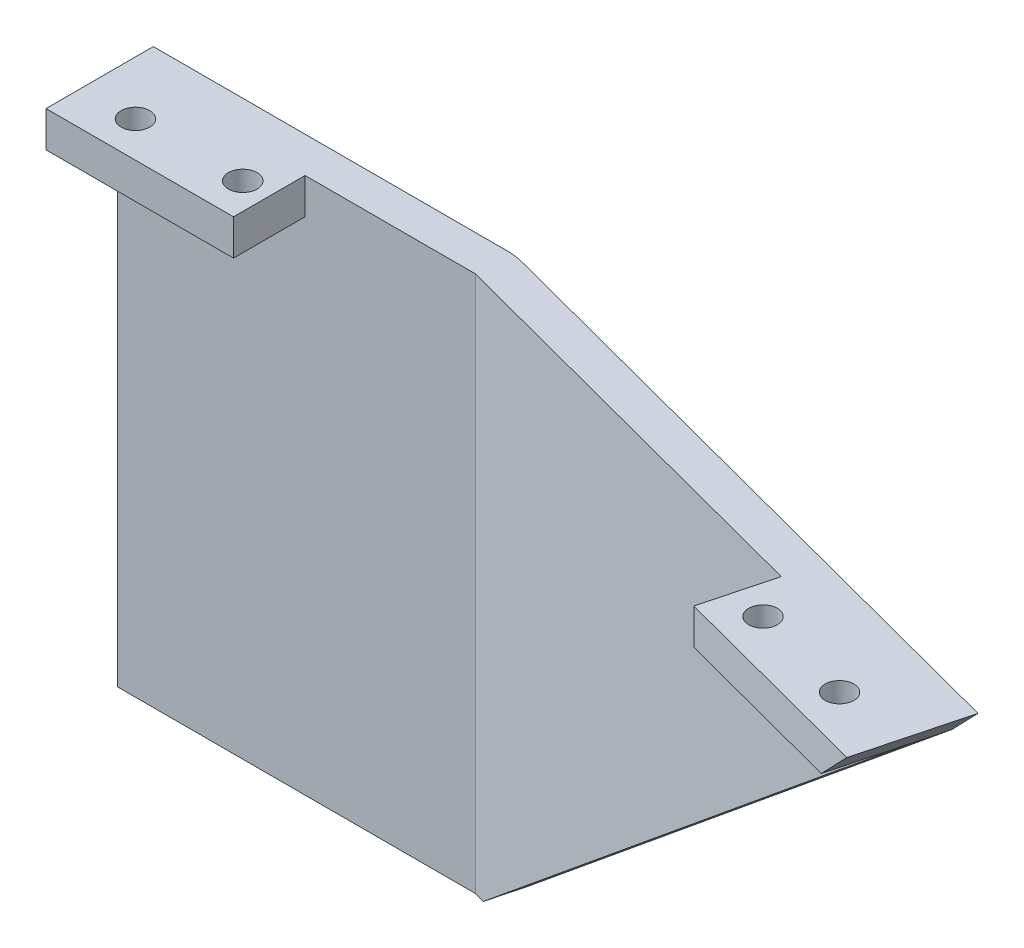
ISO-10303-21;
HEADER;
FILE_DESCRIPTION(('STEP AP214'),'2;1');
FILE_NAME('part.step','',(''),(''),'','','');
FILE_SCHEMA(('AUTOMOTIVE_DESIGN { 1 0 10303 214 1 1 1 1 }'));
ENDSEC;
DATA;
#1=APPLICATION_CONTEXT('core data for automotive mechanical design processes');
#2=APPLICATION_PROTOCOL_DEFINITION('international standard','automotive_design',2000,#1);
#3=PRODUCT_CONTEXT('',#1,'mechanical');
#4=PRODUCT('Part','Part','',(#3));
#5=PRODUCT_RELATED_PRODUCT_CATEGORY('part','',(#4));
#6=PRODUCT_DEFINITION_FORMATION('','',#4);
#7=PRODUCT_DEFINITION_CONTEXT('part definition',#1,'design');
#8=PRODUCT_DEFINITION('design','',#6,#7);
#9=PRODUCT_DEFINITION_SHAPE('','',#8);
#10=(LENGTH_UNIT() NAMED_UNIT(*) SI_UNIT(.MILLI.,.METRE.));
#11=(NAMED_UNIT(*) PLANE_ANGLE_UNIT() SI_UNIT($,.RADIAN.));
#12=(NAMED_UNIT(*) SI_UNIT($,.STERADIAN.) SOLID_ANGLE_UNIT());
#13=UNCERTAINTY_MEASURE_WITH_UNIT(LENGTH_MEASURE(1.E-05),#10,'distance_accuracy_value','');
#14=(GEOMETRIC_REPRESENTATION_CONTEXT(3) GLOBAL_UNCERTAINTY_ASSIGNED_CONTEXT((#13)) GLOBAL_UNIT_ASSIGNED_CONTEXT((#10,
#11,#12)) REPRESENTATION_CONTEXT('',''));
#15=CARTESIAN_POINT('',(0.,0.,0.));
#16=DIRECTION('',(0.,0.,1.));
#17=DIRECTION('',(1.,0.,0.));
#18=AXIS2_PLACEMENT_3D('',#15,#16,#17);
#19=CARTESIAN_POINT('',(0.,65.,0.));
#20=DIRECTION('',(0.,1.,0.));
#21=DIRECTION('',(0.,0.,1.));
#22=AXIS2_PLACEMENT_3D('',#19,#20,#21);
#23=PLANE('',#22);
#24=CARTESIAN_POINT('',(-30.,65.,20.));
#25=DIRECTION('',(0.,-1.,0.));
#26=DIRECTION('',(0.,0.,-1.));
#27=AXIS2_PLACEMENT_3D('',#24,#25,#26);
#28=CIRCLE('',#27,4.);
#29=CARTESIAN_POINT('',(-30.,65.,16.));
#30=VERTEX_POINT('',#29);
#31=EDGE_CURVE('E319',#30,#30,#28,.T.);
#32=ORIENTED_EDGE('',*,*,#31,.F.);
#33=EDGE_LOOP('',(#32));
#34=FACE_BOUND('',#33,.T.);
#35=CARTESIAN_POINT('',(-60.,65.,20.));
#36=DIRECTION('',(0.,-1.,0.));
#37=DIRECTION('',(0.,0.,-1.));
#38=AXIS2_PLACEMENT_3D('',#35,#36,#37);
#39=CIRCLE('',#38,4.00000000000001);
#40=CARTESIAN_POINT('',(-60.,65.,16.));
#41=VERTEX_POINT('',#40);
#42=EDGE_CURVE('E321',#41,#41,#39,.T.);
#43=ORIENTED_EDGE('',*,*,#42,.F.);
#44=EDGE_LOOP('',(#43));
#45=FACE_BOUND('',#44,.T.);
#46=DIRECTION('',(-1.,0.,0.));
#47=VECTOR('',#46,1.);
#48=CARTESIAN_POINT('',(-25.,65.,10.));
#49=LINE('',#48,#47);
#50=CARTESIAN_POINT('',(-22.5875308175575,65.,10.));
#51=VERTEX_POINT('',#50);
#52=CARTESIAN_POINT('',(-75.,65.,10.));
#53=VERTEX_POINT('',#52);
#54=EDGE_CURVE('E165',#51,#53,#49,.T.);
#55=ORIENTED_EDGE('',*,*,#54,.F.);
#56=DIRECTION('',(0.,0.,1.));
#57=VECTOR('',#56,1.);
#58=CARTESIAN_POINT('',(-22.5875308175575,65.,30.));
#59=LINE('',#58,#57);
#60=CARTESIAN_POINT('',(-22.5875308175575,65.,30.));
#61=VERTEX_POINT('',#60);
#62=EDGE_CURVE('E154',#51,#61,#59,.T.);
#63=ORIENTED_EDGE('',*,*,#62,.T.);
#64=DIRECTION('',(1.,0.,0.));
#65=VECTOR('',#64,1.);
#66=CARTESIAN_POINT('',(-25.,65.,30.));
#67=LINE('',#66,#65);
#68=CARTESIAN_POINT('',(-75.,65.,30.));
#69=VERTEX_POINT('',#68);
#70=EDGE_CURVE('E163',#69,#61,#67,.T.);
#71=ORIENTED_EDGE('',*,*,#70,.F.);
#72=DIRECTION('',(0.,0.,1.));
#73=VECTOR('',#72,1.);
#74=CARTESIAN_POINT('',(-75.,65.,10.));
#75=LINE('',#74,#73);
#76=EDGE_CURVE('E352',#53,#69,#75,.T.);
#77=ORIENTED_EDGE('',*,*,#76,.F.);
#78=EDGE_LOOP('',(#55,#63,#71,#77));
#79=FACE_BOUND('',#78,.T.);
#80=ADVANCED_FACE('F46',(#34,#45,#79),#23,.F.);
#81=CARTESIAN_POINT('',(0.,0.,10.));
#82=DIRECTION('',(0.,0.,1.));
#83=DIRECTION('',(1.,0.,0.));
#84=AXIS2_PLACEMENT_3D('',#81,#82,#83);
#85=PLANE('',#84);
#86=DIRECTION('',(0.,1.,0.));
#87=VECTOR('',#86,1.);
#88=CARTESIAN_POINT('',(25.,75.,10.));
#89=LINE('',#88,#87);
#90=CARTESIAN_POINT('',(25.,-75.,10.));
#91=VERTEX_POINT('',#90);
#92=CARTESIAN_POINT('',(24.9999999999966,75.,10.));
#93=VERTEX_POINT('',#92);
#94=EDGE_CURVE('E415',#91,#93,#89,.T.);
#95=ORIENTED_EDGE('',*,*,#94,.T.);
#96=DIRECTION('',(-1.,0.,0.));
#97=VECTOR('',#96,1.);
#98=CARTESIAN_POINT('',(-22.5875308175575,75.,10.));
#99=LINE('',#98,#97);
#100=CARTESIAN_POINT('',(-22.5875308175575,75.,10.));
#101=VERTEX_POINT('',#100);
#102=EDGE_CURVE('E384',#93,#101,#99,.T.);
#103=ORIENTED_EDGE('',*,*,#102,.T.);
#104=DIRECTION('',(0.,1.,0.));
#105=VECTOR('',#104,1.);
#106=CARTESIAN_POINT('',(-22.5875308175575,65.,10.));
#107=LINE('',#106,#105);
#108=EDGE_CURVE('E393',#51,#101,#107,.T.);
#109=ORIENTED_EDGE('',*,*,#108,.F.);
#110=ORIENTED_EDGE('',*,*,#54,.T.);
#111=DIRECTION('',(0.,1.,0.));
#112=VECTOR('',#111,1.);
#113=CARTESIAN_POINT('',(-75.,-75.,10.));
#114=LINE('',#113,#112);
#115=CARTESIAN_POINT('',(-75.,-75.,10.));
#116=VERTEX_POINT('',#115);
#117=EDGE_CURVE('E349',#116,#53,#114,.T.);
#118=ORIENTED_EDGE('',*,*,#117,.F.);
#119=DIRECTION('',(1.,0.,0.));
#120=VECTOR('',#119,1.);
#121=CARTESIAN_POINT('',(-25.,-75.,10.));
#122=LINE('',#121,#120);
#123=EDGE_CURVE('E57',#116,#91,#122,.T.);
#124=ORIENTED_EDGE('',*,*,#123,.T.);
#125=EDGE_LOOP('',(#95,#103,#109,#110,#118,#124));
#126=FACE_BOUND('',#125,.T.);
#127=ADVANCED_FACE('F218',(#126),#85,.T.);
#128=CARTESIAN_POINT('',(295.780870433541,75.,81.2581237983003));
#129=DIRECTION('',(0.254493299279644,0.,-0.967074537262646));
#130=DIRECTION('',(-0.967074537262646,0.,-0.254493299279644));
#131=AXIS2_PLACEMENT_3D('',#128,#129,#130);
#132=PLANE('',#131);
#133=DIRECTION('',(-0.967074537262646,0.,-0.254493299279644));
#134=VECTOR('',#133,1.);
#135=CARTESIAN_POINT('',(295.780870433541,-75.,81.2581237983003));
#136=LINE('',#135,#134);
#137=CARTESIAN_POINT('',(28.0506337621708,-75.,10.802798358466));
#138=VERTEX_POINT('',#137);
#139=EDGE_CURVE('E51',#138,#91,#136,.T.);
#140=ORIENTED_EDGE('',*,*,#139,.F.);
#141=DIRECTION('',(0.740822075351906,0.642787609686541,0.194953177724186));
#142=VECTOR('',#141,1.);
#143=CARTESIAN_POINT('',(256.589873602786,123.296185527337,70.9447035796806));
#144=LINE('',#143,#142);
#145=CARTESIAN_POINT('',(189.40267133465,65.,53.2638608775398));
#146=VERTEX_POINT('',#145);
#147=EDGE_CURVE('E367',#138,#146,#144,.T.);
#148=ORIENTED_EDGE('',*,*,#147,.T.);
#149=DIRECTION('',(-0.967074537262647,0.,-0.254493299279641));
#150=VECTOR('',#149,1.);
#151=CARTESIAN_POINT('',(24.9999999999965,65.,10.));
#152=LINE('',#151,#150);
#153=CARTESIAN_POINT('',(141.048944471514,65.,40.5391959135569));
#154=VERTEX_POINT('',#153);
#155=EDGE_CURVE('E162',#146,#154,#152,.T.);
#156=ORIENTED_EDGE('',*,*,#155,.T.);
#157=DIRECTION('',(0.,1.,0.));
#158=VECTOR('',#157,1.);
#159=CARTESIAN_POINT('',(141.048944471514,65.,40.5391959135569));
#160=LINE('',#159,#158);
#161=CARTESIAN_POINT('',(141.048944471514,75.,40.5391959135569));
#162=VERTEX_POINT('',#161);
#163=EDGE_CURVE('E65',#154,#162,#160,.T.);
#164=ORIENTED_EDGE('',*,*,#163,.T.);
#165=DIRECTION('',(-0.967074537262647,0.,-0.254493299279641));
#166=VECTOR('',#165,1.);
#167=CARTESIAN_POINT('',(24.9999999999966,75.,10.));
#168=LINE('',#167,#166);
#169=EDGE_CURVE('E382',#162,#93,#168,.T.);
#170=ORIENTED_EDGE('',*,*,#169,.T.);
#171=ORIENTED_EDGE('',*,*,#94,.F.);
#172=EDGE_LOOP('',(#140,#148,#156,#164,#170,#171));
#173=FACE_BOUND('',#172,.T.);
#174=ADVANCED_FACE('F215',(#173),#132,.F.);
#175=CARTESIAN_POINT('',(-25.,75.,10.));
#176=DIRECTION('',(0.,-1.,0.));
#177=DIRECTION('',(0.,0.,-1.));
#178=AXIS2_PLACEMENT_3D('',#175,#176,#177);
#179=PLANE('',#178);
#180=CARTESIAN_POINT('',(-60.,75.,20.));
#181=DIRECTION('',(0.,-1.,0.));
#182=DIRECTION('',(0.,0.,-1.));
#183=AXIS2_PLACEMENT_3D('',#180,#181,#182);
#184=CIRCLE('',#183,4.00000000000001);
#185=CARTESIAN_POINT('',(-60.,75.,16.));
#186=VERTEX_POINT('',#185);
#187=EDGE_CURVE('E337',#186,#186,#184,.T.);
#188=ORIENTED_EDGE('',*,*,#187,.T.);
#189=EDGE_LOOP('',(#188));
#190=FACE_BOUND('',#189,.T.);
#191=CARTESIAN_POINT('',(177.186992969227,75.,60.3896732573699));
#192=DIRECTION('',(0.,-1.,0.));
#193=DIRECTION('',(0.,0.,-1.));
#194=AXIS2_PLACEMENT_3D('',#191,#192,#193);
#195=CIRCLE('',#194,3.99999999999999);
#196=CARTESIAN_POINT('',(177.186992969227,75.,56.3896732573699));
#197=VERTEX_POINT('',#196);
#198=EDGE_CURVE('E334',#197,#197,#195,.T.);
#199=ORIENTED_EDGE('',*,*,#198,.T.);
#200=EDGE_LOOP('',(#199));
#201=FACE_BOUND('',#200,.T.);
#202=CARTESIAN_POINT('',(148.174756851348,75.,52.7548742789806));
#203=DIRECTION('',(0.,-1.,0.));
#204=DIRECTION('',(0.,0.,-1.));
#205=AXIS2_PLACEMENT_3D('',#202,#203,#204);
#206=CIRCLE('',#205,4.00000000000005);
#207=CARTESIAN_POINT('',(148.174756851348,75.,48.7548742789806));
#208=VERTEX_POINT('',#207);
#209=EDGE_CURVE('E331',#208,#208,#206,.T.);
#210=ORIENTED_EDGE('',*,*,#209,.T.);
#211=EDGE_LOOP('',(#210));
#212=FACE_BOUND('',#211,.T.);
#213=CARTESIAN_POINT('',(-30.,75.,20.));
#214=DIRECTION('',(0.,-1.,0.));
#215=DIRECTION('',(0.,0.,-1.));
#216=AXIS2_PLACEMENT_3D('',#213,#214,#215);
#217=CIRCLE('',#216,4.);
#218=CARTESIAN_POINT('',(-30.,75.,16.));
#219=VERTEX_POINT('',#218);
#220=EDGE_CURVE('E328',#219,#219,#217,.T.);
#221=ORIENTED_EDGE('',*,*,#220,.T.);
#222=EDGE_LOOP('',(#221));
#223=FACE_BOUND('',#222,.T.);
#224=DIRECTION('',(1.,0.,0.));
#225=VECTOR('',#224,1.);
#226=CARTESIAN_POINT('',(-25.,75.,30.));
#227=LINE('',#226,#225);
#228=CARTESIAN_POINT('',(-75.,75.,30.));
#229=VERTEX_POINT('',#228);
#230=CARTESIAN_POINT('',(-22.5875308175575,75.,30.));
#231=VERTEX_POINT('',#230);
#232=EDGE_CURVE('E173',#229,#231,#227,.T.);
#233=ORIENTED_EDGE('',*,*,#232,.T.);
#234=DIRECTION('',(0.,0.,1.));
#235=VECTOR('',#234,1.);
#236=CARTESIAN_POINT('',(-22.5875308175575,75.,30.));
#237=LINE('',#236,#235);
#238=EDGE_CURVE('E155',#101,#231,#237,.T.);
#239=ORIENTED_EDGE('',*,*,#238,.F.);
#240=ORIENTED_EDGE('',*,*,#102,.F.);
#241=ORIENTED_EDGE('',*,*,#169,.F.);
#242=DIRECTION('',(0.25449329927964,0.,-0.967074537262647));
#243=VECTOR('',#242,1.);
#244=CARTESIAN_POINT('',(141.048944471514,75.,40.5391959135569));
#245=LINE('',#244,#243);
#246=CARTESIAN_POINT('',(135.959078485921,75.,59.8806866588099));
#247=VERTEX_POINT('',#246);
#248=EDGE_CURVE('E379',#247,#162,#245,.T.);
#249=ORIENTED_EDGE('',*,*,#248,.F.);
#250=DIRECTION('',(0.967074537262647,0.,0.254493299279641));
#251=VECTOR('',#250,1.);
#252=CARTESIAN_POINT('',(22.4124691824425,75.,30.));
#253=LINE('',#252,#251);
#254=CARTESIAN_POINT('',(194.018596062696,75.,75.1595070737504));
#255=VERTEX_POINT('',#254);
#256=EDGE_CURVE('E159',#247,#255,#253,.T.);
#257=ORIENTED_EDGE('',*,*,#256,.T.);
#258=DIRECTION('',(0.254493299279644,0.,-0.967074537262646));
#259=VECTOR('',#258,1.);
#260=CARTESIAN_POINT('',(195.870120079377,75.,68.1237158103624));
#261=LINE('',#260,#259);
#262=CARTESIAN_POINT('',(201.653395041085,75.,46.1472709558707));
#263=VERTEX_POINT('',#262);
#264=EDGE_CURVE('E372',#255,#263,#261,.T.);
#265=ORIENTED_EDGE('',*,*,#264,.T.);
#266=DIRECTION('',(-0.967074537262646,0.,-0.254493299279644));
#267=VECTOR('',#266,1.);
#268=CARTESIAN_POINT('',(298.325803426337,75.,71.5873784256738));
#269=LINE('',#268,#267);
#270=CARTESIAN_POINT('',(27.5449329927964,75.,0.329254627373538));
#271=VERTEX_POINT('',#270);
#272=EDGE_CURVE('E172',#263,#271,#269,.T.);
#273=ORIENTED_EDGE('',*,*,#272,.T.);
#274=DIRECTION('',(0.991734474862764,0.,0.128307175826908));
#275=VECTOR('',#274,1.);
#276=CARTESIAN_POINT('',(25.,75.,0.));
#277=LINE('',#276,#275);
#278=CARTESIAN_POINT('',(25.,75.,0.));
#279=VERTEX_POINT('',#278);
#280=EDGE_CURVE('E183',#279,#271,#277,.T.);
#281=ORIENTED_EDGE('',*,*,#280,.F.);
#282=DIRECTION('',(-1.,0.,0.));
#283=VECTOR('',#282,1.);
#284=CARTESIAN_POINT('',(-25.,75.,0.));
#285=LINE('',#284,#283);
#286=CARTESIAN_POINT('',(-75.,75.,0.));
#287=VERTEX_POINT('',#286);
#288=EDGE_CURVE('E265',#279,#287,#285,.T.);
#289=ORIENTED_EDGE('',*,*,#288,.T.);
#290=DIRECTION('',(0.,0.,-1.));
#291=VECTOR('',#290,1.);
#292=CARTESIAN_POINT('',(-75.,75.,30.));
#293=LINE('',#292,#291);
#294=EDGE_CURVE('E340',#229,#287,#293,.T.);
#295=ORIENTED_EDGE('',*,*,#294,.F.);
#296=EDGE_LOOP('',(#233,#239,#240,#241,#249,#257,#265,#273,#281,#289,#295));
#297=FACE_BOUND('',#296,.T.);
#298=ADVANCED_FACE('F48',(#190,#201,#212,#223,#297),#179,.F.);
#299=CARTESIAN_POINT('',(-25.,-75.,10.));
#300=DIRECTION('',(0.,1.,0.));
#301=DIRECTION('',(0.,0.,1.));
#302=AXIS2_PLACEMENT_3D('',#299,#300,#301);
#303=PLANE('',#302);
#304=DIRECTION('',(-0.967074537262646,0.,-0.254493299279644));
#305=VECTOR('',#304,1.);
#306=CARTESIAN_POINT('',(298.325803426337,-75.,71.5873784256738));
#307=LINE('',#306,#305);
#308=CARTESIAN_POINT('',(30.5955667549672,-75.,1.13205298583954));
#309=VERTEX_POINT('',#308);
#310=CARTESIAN_POINT('',(27.5449329927964,-75.,0.329254627373538));
#311=VERTEX_POINT('',#310);
#312=EDGE_CURVE('E191',#309,#311,#307,.T.);
#313=ORIENTED_EDGE('',*,*,#312,.F.);
#314=DIRECTION('',(-0.254493299279644,0.,0.967074537262646));
#315=VECTOR('',#314,1.);
#316=CARTESIAN_POINT('',(24.8122917932589,-75.,23.1084978403313));
#317=LINE('',#316,#315);
#318=EDGE_CURVE('E364',#309,#138,#317,.T.);
#319=ORIENTED_EDGE('',*,*,#318,.T.);
#320=ORIENTED_EDGE('',*,*,#139,.T.);
#321=ORIENTED_EDGE('',*,*,#123,.F.);
#322=DIRECTION('',(0.,0.,1.));
#323=VECTOR('',#322,1.);
#324=CARTESIAN_POINT('',(-75.,-75.,0.));
#325=LINE('',#324,#323);
#326=CARTESIAN_POINT('',(-75.,-75.,0.));
#327=VERTEX_POINT('',#326);
#328=EDGE_CURVE('E346',#327,#116,#325,.T.);
#329=ORIENTED_EDGE('',*,*,#328,.F.);
#330=DIRECTION('',(1.,0.,0.));
#331=VECTOR('',#330,1.);
#332=CARTESIAN_POINT('',(-25.,-75.,0.));
#333=LINE('',#332,#331);
#334=CARTESIAN_POINT('',(25.,-75.,0.));
#335=VERTEX_POINT('',#334);
#336=EDGE_CURVE('E412',#327,#335,#333,.T.);
#337=ORIENTED_EDGE('',*,*,#336,.T.);
#338=DIRECTION('',(0.991734474862763,0.,0.128307175826916));
#339=VECTOR('',#338,1.);
#340=CARTESIAN_POINT('',(26.2724664963982,-75.,0.164627313686781));
#341=LINE('',#340,#339);
#342=EDGE_CURVE('E187',#335,#311,#341,.T.);
#343=ORIENTED_EDGE('',*,*,#342,.T.);
#344=EDGE_LOOP('',(#313,#319,#320,#321,#329,#337,#343));
#345=FACE_BOUND('',#344,.T.);
#346=ADVANCED_FACE('F279',(#345),#303,.F.);
#347=CARTESIAN_POINT('',(0.,0.,0.));
#348=DIRECTION('',(0.,0.,1.));
#349=DIRECTION('',(1.,0.,0.));
#350=AXIS2_PLACEMENT_3D('',#347,#348,#349);
#351=PLANE('',#350);
#352=DIRECTION('',(0.,1.,0.));
#353=VECTOR('',#352,1.);
#354=CARTESIAN_POINT('',(25.,0.,0.));
#355=LINE('',#354,#353);
#356=EDGE_CURVE('E255',#335,#279,#355,.T.);
#357=ORIENTED_EDGE('',*,*,#356,.F.);
#358=ORIENTED_EDGE('',*,*,#336,.F.);
#359=DIRECTION('',(0.,-1.,0.));
#360=VECTOR('',#359,1.);
#361=CARTESIAN_POINT('',(-75.,75.,0.));
#362=LINE('',#361,#360);
#363=EDGE_CURVE('E343',#287,#327,#362,.T.);
#364=ORIENTED_EDGE('',*,*,#363,.F.);
#365=ORIENTED_EDGE('',*,*,#288,.F.);
#366=EDGE_LOOP('',(#357,#358,#364,#365));
#367=FACE_BOUND('',#366,.T.);
#368=ADVANCED_FACE('F223',(#367),#351,.F.);
#369=CARTESIAN_POINT('',(0.411568284216929,0.,-3.18116624099558));
#370=DIRECTION('',(0.128307175826908,0.,-0.991734474862764));
#371=DIRECTION('',(-0.991734474862764,0.,-0.128307175826908));
#372=AXIS2_PLACEMENT_3D('',#369,#370,#371);
#373=PLANE('',#372);
#374=ORIENTED_EDGE('',*,*,#280,.T.);
#375=DIRECTION('',(0.,-1.,0.));
#376=VECTOR('',#375,1.);
#377=CARTESIAN_POINT('',(27.5449329927965,75.,0.329254627373545));
#378=LINE('',#377,#376);
#379=EDGE_CURVE('E186',#271,#311,#378,.T.);
#380=ORIENTED_EDGE('',*,*,#379,.T.);
#381=ORIENTED_EDGE('',*,*,#342,.F.);
#382=ORIENTED_EDGE('',*,*,#356,.T.);
#383=EDGE_LOOP('',(#374,#380,#381,#382));
#384=FACE_BOUND('',#383,.T.);
#385=ADVANCED_FACE('F211',(#384),#373,.T.);
#386=CARTESIAN_POINT('',(298.325803426337,-75.,71.5873784256738));
#387=DIRECTION('',(-0.254493299279644,0.,0.967074537262646));
#388=DIRECTION('',(0.967074537262646,0.,0.254493299279644));
#389=AXIS2_PLACEMENT_3D('',#386,#387,#388);
#390=PLANE('',#389);
#391=ORIENTED_EDGE('',*,*,#272,.F.);
#392=DIRECTION('',(-0.685060641650286,-0.705826719184871,-0.18027911622376));
#393=VECTOR('',#392,1.);
#394=CARTESIAN_POINT('',(177.634329287812,50.2528501160437,39.8264641786934));
#395=LINE('',#394,#393);
#396=CARTESIAN_POINT('',(191.947604327446,65.,43.593115504913));
#397=VERTEX_POINT('',#396);
#398=EDGE_CURVE('E176',#263,#397,#395,.T.);
#399=ORIENTED_EDGE('',*,*,#398,.T.);
#400=DIRECTION('',(-0.740822075351906,-0.642787609686541,-0.194953177724186));
#401=VECTOR('',#400,1.);
#402=CARTESIAN_POINT('',(187.706118942811,61.3197988523563,42.4769351405354));
#403=LINE('',#402,#401);
#404=EDGE_CURVE('E361',#397,#309,#403,.T.);
#405=ORIENTED_EDGE('',*,*,#404,.T.);
#406=ORIENTED_EDGE('',*,*,#312,.T.);
#407=ORIENTED_EDGE('',*,*,#379,.F.);
#408=EDGE_LOOP('',(#391,#399,#405,#406,#407));
#409=FACE_BOUND('',#408,.T.);
#410=ADVANCED_FACE('F201',(#409),#390,.F.);
#411=CARTESIAN_POINT('',(22.4124691824425,65.,30.));
#412=DIRECTION('',(-0.254493299279641,0.,0.967074537262647));
#413=DIRECTION('',(0.967074537262647,0.,0.254493299279641));
#414=AXIS2_PLACEMENT_3D('',#411,#412,#413);
#415=PLANE('',#414);
#416=DIRECTION('',(0.,1.,0.));
#417=VECTOR('',#416,1.);
#418=CARTESIAN_POINT('',(135.959078485921,65.,59.8806866588099));
#419=LINE('',#418,#417);
#420=CARTESIAN_POINT('',(135.959078485921,65.,59.8806866588099));
#421=VERTEX_POINT('',#420);
#422=EDGE_CURVE('E149',#421,#247,#419,.T.);
#423=ORIENTED_EDGE('',*,*,#422,.F.);
#424=DIRECTION('',(0.967074537262647,0.,0.254493299279641));
#425=VECTOR('',#424,1.);
#426=CARTESIAN_POINT('',(22.4124691824425,65.,30.));
#427=LINE('',#426,#425);
#428=CARTESIAN_POINT('',(184.312805349057,65.,72.6053516227928));
#429=VERTEX_POINT('',#428);
#430=EDGE_CURVE('E73',#421,#429,#427,.T.);
#431=ORIENTED_EDGE('',*,*,#430,.T.);
#432=DIRECTION('',(-0.685060641650286,-0.705826719184871,-0.180279116223757));
#433=VECTOR('',#432,1.);
#434=CARTESIAN_POINT('',(103.069817439468,-18.7056869518337,51.2256179623749));
#435=LINE('',#434,#433);
#436=EDGE_CURVE('E370',#255,#429,#435,.T.);
#437=ORIENTED_EDGE('',*,*,#436,.F.);
#438=ORIENTED_EDGE('',*,*,#256,.F.);
#439=EDGE_LOOP('',(#423,#431,#437,#438));
#440=FACE_BOUND('',#439,.T.);
#441=ADVANCED_FACE('F158',(#440),#415,.T.);
#442=CARTESIAN_POINT('',(-25.,65.,30.));
#443=DIRECTION('',(0.,0.,1.));
#444=DIRECTION('',(1.,0.,0.));
#445=AXIS2_PLACEMENT_3D('',#442,#443,#444);
#446=PLANE('',#445);
#447=DIRECTION('',(0.,1.,0.));
#448=VECTOR('',#447,1.);
#449=CARTESIAN_POINT('',(-22.5875308175575,65.,30.));
#450=LINE('',#449,#448);
#451=EDGE_CURVE('E324',#61,#231,#450,.T.);
#452=ORIENTED_EDGE('',*,*,#451,.T.);
#453=ORIENTED_EDGE('',*,*,#232,.F.);
#454=DIRECTION('',(0.,1.,0.));
#455=VECTOR('',#454,1.);
#456=CARTESIAN_POINT('',(-75.,65.,30.));
#457=LINE('',#456,#455);
#458=EDGE_CURVE('E355',#69,#229,#457,.T.);
#459=ORIENTED_EDGE('',*,*,#458,.F.);
#460=ORIENTED_EDGE('',*,*,#70,.T.);
#461=EDGE_LOOP('',(#452,#453,#459,#460));
#462=FACE_BOUND('',#461,.T.);
#463=ADVANCED_FACE('F213',(#462),#446,.T.);
#464=CARTESIAN_POINT('',(177.186992969227,65.,60.3896732573699));
#465=DIRECTION('',(0.,-1.,0.));
#466=DIRECTION('',(0.,0.,-1.));
#467=AXIS2_PLACEMENT_3D('',#464,#465,#466);
#468=CIRCLE('',#467,3.99999999999999);
#469=CARTESIAN_POINT('',(177.186992969227,65.,56.3896732573699));
#470=VERTEX_POINT('',#469);
#471=EDGE_CURVE('E314',#470,#470,#468,.T.);
#472=ORIENTED_EDGE('',*,*,#471,.F.);
#473=EDGE_LOOP('',(#472));
#474=FACE_BOUND('',#473,.T.);
#475=CARTESIAN_POINT('',(148.174756851348,65.,52.7548742789806));
#476=DIRECTION('',(0.,-1.,0.));
#477=DIRECTION('',(0.,0.,-1.));
#478=AXIS2_PLACEMENT_3D('',#475,#476,#477);
#479=CIRCLE('',#478,4.00000000000005);
#480=CARTESIAN_POINT('',(148.174756851348,65.,48.7548742789806));
#481=VERTEX_POINT('',#480);
#482=EDGE_CURVE('E317',#481,#481,#479,.T.);
#483=ORIENTED_EDGE('',*,*,#482,.F.);
#484=EDGE_LOOP('',(#483));
#485=FACE_BOUND('',#484,.T.);
#486=ORIENTED_EDGE('',*,*,#430,.F.);
#487=DIRECTION('',(0.25449329927964,0.,-0.967074537262647));
#488=VECTOR('',#487,1.);
#489=CARTESIAN_POINT('',(141.048944471514,65.,40.5391959135569));
#490=LINE('',#489,#488);
#491=EDGE_CURVE('E147',#421,#154,#490,.T.);
#492=ORIENTED_EDGE('',*,*,#491,.T.);
#493=ORIENTED_EDGE('',*,*,#155,.F.);
#494=DIRECTION('',(-0.254493299279644,0.,0.967074537262646));
#495=VECTOR('',#494,1.);
#496=CARTESIAN_POINT('',(190.244640246567,65.,50.0643790122545));
#497=LINE('',#496,#495);
#498=EDGE_CURVE('E12',#146,#429,#497,.T.);
#499=ORIENTED_EDGE('',*,*,#498,.T.);
#500=EDGE_LOOP('',(#486,#492,#493,#499));
#501=FACE_BOUND('',#500,.T.);
#502=ADVANCED_FACE('F161',(#474,#485,#501),#23,.F.);
#503=CARTESIAN_POINT('',(202.127336298632,65.,4.91013401440715));
#504=DIRECTION('',(-0.682587047843321,0.708384530099805,-0.179628170485085));
#505=DIRECTION('',(-0.720097215031297,-0.693873187912726,0.));
#506=AXIS2_PLACEMENT_3D('',#503,#504,#505);
#507=PLANE('',#506);
#508=ORIENTED_EDGE('',*,*,#264,.F.);
#509=ORIENTED_EDGE('',*,*,#436,.T.);
#510=ORIENTED_EDGE('',*,*,#498,.F.);
#511=DIRECTION('',(-0.254493299279644,0.,0.967074537262646));
#512=VECTOR('',#511,1.);
#513=CARTESIAN_POINT('',(202.127336298632,65.,4.91013401440715));
#514=LINE('',#513,#512);
#515=EDGE_CURVE('E358',#397,#146,#514,.T.);
#516=ORIENTED_EDGE('',*,*,#515,.F.);
#517=ORIENTED_EDGE('',*,*,#398,.F.);
#518=EDGE_LOOP('',(#508,#509,#510,#516,#517));
#519=FACE_BOUND('',#518,.T.);
#520=ADVANCED_FACE('F302',(#519),#507,.F.);
#521=CARTESIAN_POINT('',(202.127336298632,65.,4.91013401440715));
#522=DIRECTION('',(-0.621623530195774,0.766044443118977,-0.163585139525204));
#523=DIRECTION('',(-0.776504565202097,-0.630111625206442,0.));
#524=AXIS2_PLACEMENT_3D('',#521,#522,#523);
#525=PLANE('',#524);
#526=ORIENTED_EDGE('',*,*,#318,.F.);
#527=ORIENTED_EDGE('',*,*,#404,.F.);
#528=ORIENTED_EDGE('',*,*,#515,.T.);
#529=ORIENTED_EDGE('',*,*,#147,.F.);
#530=EDGE_LOOP('',(#526,#527,#528,#529));
#531=FACE_BOUND('',#530,.T.);
#532=ADVANCED_FACE('F308',(#531),#525,.F.);
#533=CARTESIAN_POINT('',(-75.,0.,0.));
#534=DIRECTION('',(-1.,0.,0.));
#535=DIRECTION('',(0.,0.,1.));
#536=AXIS2_PLACEMENT_3D('',#533,#534,#535);
#537=PLANE('',#536);
#538=ORIENTED_EDGE('',*,*,#294,.T.);
#539=ORIENTED_EDGE('',*,*,#363,.T.);
#540=ORIENTED_EDGE('',*,*,#328,.T.);
#541=ORIENTED_EDGE('',*,*,#117,.T.);
#542=ORIENTED_EDGE('',*,*,#76,.T.);
#543=ORIENTED_EDGE('',*,*,#458,.T.);
#544=EDGE_LOOP('',(#538,#539,#540,#541,#542,#543));
#545=FACE_BOUND('',#544,.T.);
#546=ADVANCED_FACE('F408',(#545),#537,.T.);
#547=CARTESIAN_POINT('',(-30.,95.,20.));
#548=DIRECTION('',(0.,-1.,0.));
#549=DIRECTION('',(0.,0.,-1.));
#550=AXIS2_PLACEMENT_3D('',#547,#548,#549);
#551=CYLINDRICAL_SURFACE('',#550,4.);
#552=ORIENTED_EDGE('',*,*,#31,.T.);
#553=EDGE_LOOP('',(#552));
#554=FACE_BOUND('',#553,.T.);
#555=ORIENTED_EDGE('',*,*,#220,.F.);
#556=EDGE_LOOP('',(#555));
#557=FACE_BOUND('',#556,.T.);
#558=ADVANCED_FACE('F438',(#554,#557),#551,.F.);
#559=CARTESIAN_POINT('',(148.174756851348,95.,52.7548742789806));
#560=DIRECTION('',(0.,-1.,0.));
#561=DIRECTION('',(0.,0.,-1.));
#562=AXIS2_PLACEMENT_3D('',#559,#560,#561);
#563=CYLINDRICAL_SURFACE('',#562,4.00000000000005);
#564=ORIENTED_EDGE('',*,*,#482,.T.);
#565=EDGE_LOOP('',(#564));
#566=FACE_BOUND('',#565,.T.);
#567=ORIENTED_EDGE('',*,*,#209,.F.);
#568=EDGE_LOOP('',(#567));
#569=FACE_BOUND('',#568,.T.);
#570=ADVANCED_FACE('F443',(#566,#569),#563,.F.);
#571=CARTESIAN_POINT('',(177.186992969227,95.,60.3896732573699));
#572=DIRECTION('',(0.,-1.,0.));
#573=DIRECTION('',(0.,0.,-1.));
#574=AXIS2_PLACEMENT_3D('',#571,#572,#573);
#575=CYLINDRICAL_SURFACE('',#574,3.99999999999999);
#576=ORIENTED_EDGE('',*,*,#471,.T.);
#577=EDGE_LOOP('',(#576));
#578=FACE_BOUND('',#577,.T.);
#579=ORIENTED_EDGE('',*,*,#198,.F.);
#580=EDGE_LOOP('',(#579));
#581=FACE_BOUND('',#580,.T.);
#582=ADVANCED_FACE('F447',(#578,#581),#575,.F.);
#583=CARTESIAN_POINT('',(-60.,95.,20.));
#584=DIRECTION('',(0.,-1.,0.));
#585=DIRECTION('',(0.,0.,-1.));
#586=AXIS2_PLACEMENT_3D('',#583,#584,#585);
#587=CYLINDRICAL_SURFACE('',#586,4.00000000000001);
#588=ORIENTED_EDGE('',*,*,#42,.T.);
#589=EDGE_LOOP('',(#588));
#590=FACE_BOUND('',#589,.T.);
#591=ORIENTED_EDGE('',*,*,#187,.F.);
#592=EDGE_LOOP('',(#591));
#593=FACE_BOUND('',#592,.T.);
#594=ADVANCED_FACE('F398',(#590,#593),#587,.F.);
#595=CARTESIAN_POINT('',(-22.5875308175575,65.,30.));
#596=DIRECTION('',(-1.,0.,0.));
#597=DIRECTION('',(0.,0.,1.));
#598=AXIS2_PLACEMENT_3D('',#595,#596,#597);
#599=PLANE('',#598);
#600=ORIENTED_EDGE('',*,*,#238,.T.);
#601=ORIENTED_EDGE('',*,*,#451,.F.);
#602=ORIENTED_EDGE('',*,*,#62,.F.);
#603=ORIENTED_EDGE('',*,*,#108,.T.);
#604=EDGE_LOOP('',(#600,#601,#602,#603));
#605=FACE_BOUND('',#604,.T.);
#606=ADVANCED_FACE('F431',(#605),#599,.F.);
#607=CARTESIAN_POINT('',(141.048944471514,65.,40.5391959135569));
#608=DIRECTION('',(0.967074537262647,0.,0.25449329927964));
#609=DIRECTION('',(0.25449329927964,0.,-0.967074537262647));
#610=AXIS2_PLACEMENT_3D('',#607,#608,#609);
#611=PLANE('',#610);
#612=ORIENTED_EDGE('',*,*,#248,.T.);
#613=ORIENTED_EDGE('',*,*,#163,.F.);
#614=ORIENTED_EDGE('',*,*,#491,.F.);
#615=ORIENTED_EDGE('',*,*,#422,.T.);
#616=EDGE_LOOP('',(#612,#613,#614,#615));
#617=FACE_BOUND('',#616,.T.);
#618=ADVANCED_FACE('F148',(#617),#611,.F.);
#619=CLOSED_SHELL('',(#80,#127,#174,#298,#346,#368,#385,#410,#441,#463,#502,#520,#532,#546,#558,
#570,#582,#594,#606,#618));
#620=MANIFOLD_SOLID_BREP('B2',#619);
#621=ADVANCED_BREP_SHAPE_REPRESENTATION('',(#18,#620),#14);
#622=SHAPE_DEFINITION_REPRESENTATION(#9,#621);
ENDSEC;
END-ISO-10303-21;
